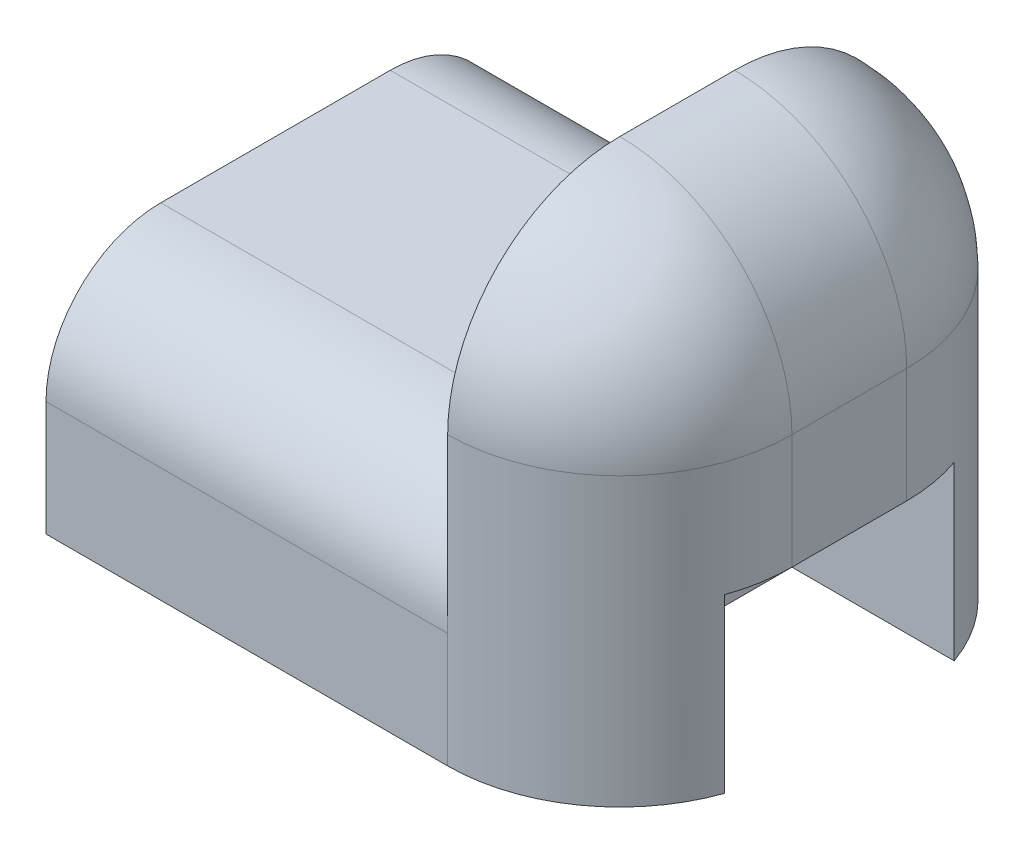
ISO-10303-21;
HEADER;
FILE_DESCRIPTION(('STEP AP214'),'2;1');
FILE_NAME('part.step','',(''),(''),'','','');
FILE_SCHEMA(('AUTOMOTIVE_DESIGN { 1 0 10303 214 1 1 1 1 }'));
ENDSEC;
DATA;
#1=APPLICATION_CONTEXT('core data for automotive mechanical design processes');
#2=APPLICATION_PROTOCOL_DEFINITION('international standard','automotive_design',2000,#1);
#3=PRODUCT_CONTEXT('',#1,'mechanical');
#4=PRODUCT('Part','Part','',(#3));
#5=PRODUCT_RELATED_PRODUCT_CATEGORY('part','',(#4));
#6=PRODUCT_DEFINITION_FORMATION('','',#4);
#7=PRODUCT_DEFINITION_CONTEXT('part definition',#1,'design');
#8=PRODUCT_DEFINITION('design','',#6,#7);
#9=PRODUCT_DEFINITION_SHAPE('','',#8);
#10=(LENGTH_UNIT() NAMED_UNIT(*) SI_UNIT(.MILLI.,.METRE.));
#11=(NAMED_UNIT(*) PLANE_ANGLE_UNIT() SI_UNIT($,.RADIAN.));
#12=(NAMED_UNIT(*) SI_UNIT($,.STERADIAN.) SOLID_ANGLE_UNIT());
#13=UNCERTAINTY_MEASURE_WITH_UNIT(LENGTH_MEASURE(1.E-05),#10,'distance_accuracy_value','');
#14=(GEOMETRIC_REPRESENTATION_CONTEXT(3) GLOBAL_UNCERTAINTY_ASSIGNED_CONTEXT((#13)) GLOBAL_UNIT_ASSIGNED_CONTEXT((#10,
#11,#12)) REPRESENTATION_CONTEXT('',''));
#15=CARTESIAN_POINT('',(0.,0.,0.));
#16=DIRECTION('',(0.,0.,1.));
#17=DIRECTION('',(1.,0.,0.));
#18=AXIS2_PLACEMENT_3D('',#15,#16,#17);
#19=CARTESIAN_POINT('',(-50.,80.,-20.));
#20=DIRECTION('',(1.,0.,0.));
#21=DIRECTION('',(0.,0.,-1.));
#22=AXIS2_PLACEMENT_3D('',#19,#20,#21);
#23=PLANE('',#22);
#24=DIRECTION('',(0.,0.,1.));
#25=VECTOR('',#24,1.);
#26=CARTESIAN_POINT('',(-50.,40.,-20.));
#27=LINE('',#26,#25);
#28=CARTESIAN_POINT('',(-50.,40.,0.));
#29=VERTEX_POINT('',#28);
#30=CARTESIAN_POINT('',(-50.,40.,40.));
#31=VERTEX_POINT('',#30);
#32=EDGE_CURVE('E326',#29,#31,#27,.T.);
#33=ORIENTED_EDGE('',*,*,#32,.F.);
#34=CARTESIAN_POINT('',(-50.,20.,0.));
#35=DIRECTION('',(1.,0.,0.));
#36=DIRECTION('',(0.,0.,-1.));
#37=AXIS2_PLACEMENT_3D('',#34,#35,#36);
#38=CIRCLE('',#37,20.);
#39=CARTESIAN_POINT('',(-50.,20.,-20.));
#40=VERTEX_POINT('',#39);
#41=EDGE_CURVE('E61',#29,#40,#38,.F.);
#42=ORIENTED_EDGE('',*,*,#41,.T.);
#43=DIRECTION('',(0.,-1.,0.));
#44=VECTOR('',#43,1.);
#45=CARTESIAN_POINT('',(-50.,80.,-20.));
#46=LINE('',#45,#44);
#47=CARTESIAN_POINT('',(-50.,0.,-20.));
#48=VERTEX_POINT('',#47);
#49=EDGE_CURVE('E247',#40,#48,#46,.T.);
#50=ORIENTED_EDGE('',*,*,#49,.T.);
#51=DIRECTION('',(0.,0.,1.));
#52=VECTOR('',#51,1.);
#53=CARTESIAN_POINT('',(-50.,0.,-20.));
#54=LINE('',#53,#52);
#55=CARTESIAN_POINT('',(-50.,0.,0.));
#56=VERTEX_POINT('',#55);
#57=EDGE_CURVE('E244',#48,#56,#54,.T.);
#58=ORIENTED_EDGE('',*,*,#57,.T.);
#59=DIRECTION('',(0.,-1.,0.));
#60=VECTOR('',#59,1.);
#61=CARTESIAN_POINT('',(-50.,0.,0.));
#62=LINE('',#61,#60);
#63=CARTESIAN_POINT('',(-50.,30.,0.));
#64=VERTEX_POINT('',#63);
#65=EDGE_CURVE('E233',#64,#56,#62,.T.);
#66=ORIENTED_EDGE('',*,*,#65,.F.);
#67=DIRECTION('',(0.,0.,1.));
#68=VECTOR('',#67,1.);
#69=CARTESIAN_POINT('',(-50.,30.,0.));
#70=LINE('',#69,#68);
#71=CARTESIAN_POINT('',(-50.,30.,40.));
#72=VERTEX_POINT('',#71);
#73=EDGE_CURVE('E236',#64,#72,#70,.T.);
#74=ORIENTED_EDGE('',*,*,#73,.T.);
#75=DIRECTION('',(0.,-1.,0.));
#76=VECTOR('',#75,1.);
#77=CARTESIAN_POINT('',(-50.,0.,40.));
#78=LINE('',#77,#76);
#79=CARTESIAN_POINT('',(-50.,0.,40.));
#80=VERTEX_POINT('',#79);
#81=EDGE_CURVE('E197',#72,#80,#78,.T.);
#82=ORIENTED_EDGE('',*,*,#81,.T.);
#83=DIRECTION('',(0.,0.,-1.));
#84=VECTOR('',#83,1.);
#85=CARTESIAN_POINT('',(-50.,0.,60.));
#86=LINE('',#85,#84);
#87=CARTESIAN_POINT('',(-50.,0.,60.));
#88=VERTEX_POINT('',#87);
#89=EDGE_CURVE('E206',#88,#80,#86,.T.);
#90=ORIENTED_EDGE('',*,*,#89,.F.);
#91=DIRECTION('',(0.,-1.,0.));
#92=VECTOR('',#91,1.);
#93=CARTESIAN_POINT('',(-50.,80.,60.));
#94=LINE('',#93,#92);
#95=CARTESIAN_POINT('',(-50.,20.,60.));
#96=VERTEX_POINT('',#95);
#97=EDGE_CURVE('E212',#96,#88,#94,.T.);
#98=ORIENTED_EDGE('',*,*,#97,.F.);
#99=CARTESIAN_POINT('',(-50.,20.,40.));
#100=DIRECTION('',(1.,0.,0.));
#101=DIRECTION('',(0.,0.,-1.));
#102=AXIS2_PLACEMENT_3D('',#99,#100,#101);
#103=CIRCLE('',#102,20.);
#104=EDGE_CURVE('E297',#96,#31,#103,.F.);
#105=ORIENTED_EDGE('',*,*,#104,.T.);
#106=EDGE_LOOP('',(#33,#42,#50,#58,#66,#74,#82,#90,#98,#105));
#107=FACE_BOUND('',#106,.T.);
#108=ADVANCED_FACE('F39',(#107),#23,.F.);
#109=CARTESIAN_POINT('',(50.,80.,-20.));
#110=DIRECTION('',(-1.,0.,0.));
#111=DIRECTION('',(0.,0.,1.));
#112=AXIS2_PLACEMENT_3D('',#109,#110,#111);
#113=PLANE('',#112);
#114=DIRECTION('',(0.,0.,1.));
#115=VECTOR('',#114,1.);
#116=CARTESIAN_POINT('',(50.,30.,0.));
#117=LINE('',#116,#115);
#118=CARTESIAN_POINT('',(50.,30.,9.99999999999999));
#119=VERTEX_POINT('',#118);
#120=CARTESIAN_POINT('',(50.,30.,30.));
#121=VERTEX_POINT('',#120);
#122=EDGE_CURVE('E183',#119,#121,#117,.T.);
#123=ORIENTED_EDGE('',*,*,#122,.F.);
#124=DIRECTION('',(0.,-1.,0.));
#125=VECTOR('',#124,1.);
#126=CARTESIAN_POINT('',(50.,80.,9.99999999999999));
#127=LINE('',#126,#125);
#128=CARTESIAN_POINT('',(50.,50.,9.99999999999999));
#129=VERTEX_POINT('',#128);
#130=EDGE_CURVE('E283',#119,#129,#127,.F.);
#131=ORIENTED_EDGE('',*,*,#130,.T.);
#132=DIRECTION('',(0.,0.,-1.));
#133=VECTOR('',#132,1.);
#134=CARTESIAN_POINT('',(50.,50.,60.));
#135=LINE('',#134,#133);
#136=CARTESIAN_POINT('',(50.,50.,30.));
#137=VERTEX_POINT('',#136);
#138=EDGE_CURVE('E252',#129,#137,#135,.F.);
#139=ORIENTED_EDGE('',*,*,#138,.T.);
#140=DIRECTION('',(0.,-1.,0.));
#141=VECTOR('',#140,1.);
#142=CARTESIAN_POINT('',(50.,0.,30.));
#143=LINE('',#142,#141);
#144=EDGE_CURVE('E254',#137,#121,#143,.T.);
#145=ORIENTED_EDGE('',*,*,#144,.T.);
#146=EDGE_LOOP('',(#123,#131,#139,#145));
#147=FACE_BOUND('',#146,.T.);
#148=ADVANCED_FACE('F345',(#147),#113,.F.);
#149=CARTESIAN_POINT('',(0.,0.,0.));
#150=DIRECTION('',(0.,1.,0.));
#151=DIRECTION('',(0.,0.,1.));
#152=AXIS2_PLACEMENT_3D('',#149,#150,#151);
#153=PLANE('',#152);
#154=DIRECTION('',(-1.,0.,0.));
#155=VECTOR('',#154,1.);
#156=CARTESIAN_POINT('',(-50.,0.,-20.));
#157=LINE('',#156,#155);
#158=CARTESIAN_POINT('',(20.,0.,-20.));
#159=VERTEX_POINT('',#158);
#160=EDGE_CURVE('E238',#159,#48,#157,.T.);
#161=ORIENTED_EDGE('',*,*,#160,.F.);
#162=CARTESIAN_POINT('',(20.,0.,10.));
#163=DIRECTION('',(0.,1.,0.));
#164=DIRECTION('',(0.,0.,1.));
#165=AXIS2_PLACEMENT_3D('',#162,#163,#164);
#166=CIRCLE('',#165,30.);
#167=CARTESIAN_POINT('',(48.2842712474619,0.,0.));
#168=VERTEX_POINT('',#167);
#169=EDGE_CURVE('E277',#159,#168,#166,.F.);
#170=ORIENTED_EDGE('',*,*,#169,.T.);
#171=DIRECTION('',(1.,0.,0.));
#172=VECTOR('',#171,1.);
#173=CARTESIAN_POINT('',(0.,0.,0.));
#174=LINE('',#173,#172);
#175=CARTESIAN_POINT('',(20.,0.,0.));
#176=VERTEX_POINT('',#175);
#177=EDGE_CURVE('E218',#176,#168,#174,.T.);
#178=ORIENTED_EDGE('',*,*,#177,.F.);
#179=DIRECTION('',(0.,0.,1.));
#180=VECTOR('',#179,1.);
#181=CARTESIAN_POINT('',(20.,0.,0.));
#182=LINE('',#181,#180);
#183=CARTESIAN_POINT('',(20.,0.,40.));
#184=VERTEX_POINT('',#183);
#185=EDGE_CURVE('E222',#176,#184,#182,.T.);
#186=ORIENTED_EDGE('',*,*,#185,.T.);
#187=DIRECTION('',(1.,0.,0.));
#188=VECTOR('',#187,1.);
#189=CARTESIAN_POINT('',(0.,0.,40.));
#190=LINE('',#189,#188);
#191=CARTESIAN_POINT('',(48.2842712474619,0.,40.));
#192=VERTEX_POINT('',#191);
#193=EDGE_CURVE('E173',#184,#192,#190,.T.);
#194=ORIENTED_EDGE('',*,*,#193,.T.);
#195=CARTESIAN_POINT('',(20.,0.,30.));
#196=DIRECTION('',(0.,1.,0.));
#197=DIRECTION('',(0.,0.,1.));
#198=AXIS2_PLACEMENT_3D('',#195,#196,#197);
#199=CIRCLE('',#198,30.);
#200=CARTESIAN_POINT('',(20.,0.,60.));
#201=VERTEX_POINT('',#200);
#202=EDGE_CURVE('E260',#192,#201,#199,.F.);
#203=ORIENTED_EDGE('',*,*,#202,.T.);
#204=DIRECTION('',(-1.,0.,0.));
#205=VECTOR('',#204,1.);
#206=CARTESIAN_POINT('',(-50.,0.,60.));
#207=LINE('',#206,#205);
#208=EDGE_CURVE('E209',#201,#88,#207,.T.);
#209=ORIENTED_EDGE('',*,*,#208,.T.);
#210=ORIENTED_EDGE('',*,*,#89,.T.);
#211=DIRECTION('',(1.,0.,0.));
#212=VECTOR('',#211,1.);
#213=CARTESIAN_POINT('',(0.,0.,40.));
#214=LINE('',#213,#212);
#215=CARTESIAN_POINT('',(-20.,0.,40.));
#216=VERTEX_POINT('',#215);
#217=EDGE_CURVE('E194',#80,#216,#214,.T.);
#218=ORIENTED_EDGE('',*,*,#217,.T.);
#219=DIRECTION('',(0.,0.,1.));
#220=VECTOR('',#219,1.);
#221=CARTESIAN_POINT('',(-20.,0.,0.));
#222=LINE('',#221,#220);
#223=CARTESIAN_POINT('',(-20.,0.,0.));
#224=VERTEX_POINT('',#223);
#225=EDGE_CURVE('E235',#224,#216,#222,.T.);
#226=ORIENTED_EDGE('',*,*,#225,.F.);
#227=DIRECTION('',(1.,0.,0.));
#228=VECTOR('',#227,1.);
#229=CARTESIAN_POINT('',(0.,0.,0.));
#230=LINE('',#229,#228);
#231=EDGE_CURVE('E182',#56,#224,#230,.T.);
#232=ORIENTED_EDGE('',*,*,#231,.F.);
#233=ORIENTED_EDGE('',*,*,#57,.F.);
#234=EDGE_LOOP('',(#161,#170,#178,#186,#194,#203,#209,#210,#218,#226,#232,#233));
#235=FACE_BOUND('',#234,.T.);
#236=ADVANCED_FACE('F356',(#235),#153,.F.);
#237=CARTESIAN_POINT('',(-50.,80.,-20.));
#238=DIRECTION('',(0.,0.,1.));
#239=DIRECTION('',(1.,0.,0.));
#240=AXIS2_PLACEMENT_3D('',#237,#238,#239);
#241=PLANE('',#240);
#242=ORIENTED_EDGE('',*,*,#49,.F.);
#243=DIRECTION('',(-1.,0.,0.));
#244=VECTOR('',#243,1.);
#245=CARTESIAN_POINT('',(20.,20.,-20.));
#246=LINE('',#245,#244);
#247=CARTESIAN_POINT('',(20.,20.,-20.));
#248=VERTEX_POINT('',#247);
#249=EDGE_CURVE('E47',#40,#248,#246,.F.);
#250=ORIENTED_EDGE('',*,*,#249,.T.);
#251=DIRECTION('',(0.,-1.,0.));
#252=VECTOR('',#251,1.);
#253=CARTESIAN_POINT('',(20.,80.,-20.));
#254=LINE('',#253,#252);
#255=EDGE_CURVE('E270',#248,#159,#254,.T.);
#256=ORIENTED_EDGE('',*,*,#255,.T.);
#257=ORIENTED_EDGE('',*,*,#160,.T.);
#258=EDGE_LOOP('',(#242,#250,#256,#257));
#259=FACE_BOUND('',#258,.T.);
#260=ADVANCED_FACE('F309',(#259),#241,.F.);
#261=CARTESIAN_POINT('',(0.,30.,0.));
#262=DIRECTION('',(0.,-1.,0.));
#263=DIRECTION('',(1.,0.,0.));
#264=AXIS2_PLACEMENT_3D('',#261,#262,#263);
#265=PLANE('',#264);
#266=DIRECTION('',(0.,0.,1.));
#267=VECTOR('',#266,1.);
#268=CARTESIAN_POINT('',(-20.,30.,0.));
#269=LINE('',#268,#267);
#270=CARTESIAN_POINT('',(-20.,30.,0.));
#271=VERTEX_POINT('',#270);
#272=CARTESIAN_POINT('',(-20.,30.,40.));
#273=VERTEX_POINT('',#272);
#274=EDGE_CURVE('E239',#271,#273,#269,.T.);
#275=ORIENTED_EDGE('',*,*,#274,.T.);
#276=DIRECTION('',(1.,0.,0.));
#277=VECTOR('',#276,1.);
#278=CARTESIAN_POINT('',(0.,30.,40.));
#279=LINE('',#278,#277);
#280=EDGE_CURVE('E200',#72,#273,#279,.T.);
#281=ORIENTED_EDGE('',*,*,#280,.F.);
#282=ORIENTED_EDGE('',*,*,#73,.F.);
#283=DIRECTION('',(1.,0.,0.));
#284=VECTOR('',#283,1.);
#285=CARTESIAN_POINT('',(0.,30.,0.));
#286=LINE('',#285,#284);
#287=EDGE_CURVE('E231',#64,#271,#286,.T.);
#288=ORIENTED_EDGE('',*,*,#287,.T.);
#289=EDGE_LOOP('',(#275,#281,#282,#288));
#290=FACE_BOUND('',#289,.T.);
#291=ADVANCED_FACE('F383',(#290),#265,.T.);
#292=CARTESIAN_POINT('',(-20.,0.,0.));
#293=DIRECTION('',(1.,0.,0.));
#294=DIRECTION('',(0.,1.,0.));
#295=AXIS2_PLACEMENT_3D('',#292,#293,#294);
#296=PLANE('',#295);
#297=ORIENTED_EDGE('',*,*,#225,.T.);
#298=DIRECTION('',(0.,1.,0.));
#299=VECTOR('',#298,1.);
#300=CARTESIAN_POINT('',(-20.,0.,40.));
#301=LINE('',#300,#299);
#302=EDGE_CURVE('E203',#216,#273,#301,.T.);
#303=ORIENTED_EDGE('',*,*,#302,.T.);
#304=ORIENTED_EDGE('',*,*,#274,.F.);
#305=DIRECTION('',(0.,1.,0.));
#306=VECTOR('',#305,1.);
#307=CARTESIAN_POINT('',(-20.,0.,0.));
#308=LINE('',#307,#306);
#309=EDGE_CURVE('E228',#224,#271,#308,.T.);
#310=ORIENTED_EDGE('',*,*,#309,.F.);
#311=EDGE_LOOP('',(#297,#303,#304,#310));
#312=FACE_BOUND('',#311,.T.);
#313=ADVANCED_FACE('F420',(#312),#296,.F.);
#314=CARTESIAN_POINT('',(0.,0.,0.));
#315=DIRECTION('',(0.,0.,1.));
#316=DIRECTION('',(1.,0.,0.));
#317=AXIS2_PLACEMENT_3D('',#314,#315,#316);
#318=PLANE('',#317);
#319=CARTESIAN_POINT('',(-43.,7.,0.));
#320=DIRECTION('',(0.,0.,1.));
#321=DIRECTION('',(1.,0.,0.));
#322=AXIS2_PLACEMENT_3D('',#319,#320,#321);
#323=CIRCLE('',#322,5.);
#324=CARTESIAN_POINT('',(-38.,7.,0.));
#325=VERTEX_POINT('',#324);
#326=EDGE_CURVE('E214',#325,#325,#323,.T.);
#327=ORIENTED_EDGE('',*,*,#326,.F.);
#328=EDGE_LOOP('',(#327));
#329=FACE_BOUND('',#328,.T.);
#330=ORIENTED_EDGE('',*,*,#231,.T.);
#331=ORIENTED_EDGE('',*,*,#309,.T.);
#332=ORIENTED_EDGE('',*,*,#287,.F.);
#333=ORIENTED_EDGE('',*,*,#65,.T.);
#334=EDGE_LOOP('',(#330,#331,#332,#333));
#335=FACE_BOUND('',#334,.T.);
#336=ADVANCED_FACE('F418',(#329,#335),#318,.T.);
#337=CARTESIAN_POINT('',(20.,0.,0.));
#338=DIRECTION('',(1.,0.,0.));
#339=DIRECTION('',(0.,0.,-1.));
#340=AXIS2_PLACEMENT_3D('',#337,#338,#339);
#341=PLANE('',#340);
#342=DIRECTION('',(0.,0.,1.));
#343=VECTOR('',#342,1.);
#344=CARTESIAN_POINT('',(20.,30.,0.));
#345=LINE('',#344,#343);
#346=CARTESIAN_POINT('',(20.,30.,0.));
#347=VERTEX_POINT('',#346);
#348=CARTESIAN_POINT('',(20.,30.,40.));
#349=VERTEX_POINT('',#348);
#350=EDGE_CURVE('E167',#347,#349,#345,.T.);
#351=ORIENTED_EDGE('',*,*,#350,.T.);
#352=DIRECTION('',(0.,1.,0.));
#353=VECTOR('',#352,1.);
#354=CARTESIAN_POINT('',(20.,0.,40.));
#355=LINE('',#354,#353);
#356=EDGE_CURVE('E174',#184,#349,#355,.T.);
#357=ORIENTED_EDGE('',*,*,#356,.F.);
#358=ORIENTED_EDGE('',*,*,#185,.F.);
#359=DIRECTION('',(0.,1.,0.));
#360=VECTOR('',#359,1.);
#361=CARTESIAN_POINT('',(20.,0.,0.));
#362=LINE('',#361,#360);
#363=EDGE_CURVE('E181',#176,#347,#362,.T.);
#364=ORIENTED_EDGE('',*,*,#363,.T.);
#365=EDGE_LOOP('',(#351,#357,#358,#364));
#366=FACE_BOUND('',#365,.T.);
#367=ADVANCED_FACE('F179',(#366),#341,.T.);
#368=CARTESIAN_POINT('',(0.,30.,0.));
#369=DIRECTION('',(0.,1.,0.));
#370=DIRECTION('',(-1.,0.,0.));
#371=AXIS2_PLACEMENT_3D('',#368,#369,#370);
#372=PLANE('',#371);
#373=CARTESIAN_POINT('',(43.,30.,20.));
#374=DIRECTION('',(0.,-1.,0.));
#375=DIRECTION('',(1.,0.,0.));
#376=AXIS2_PLACEMENT_3D('',#373,#374,#375);
#377=CIRCLE('',#376,5.);
#378=CARTESIAN_POINT('',(48.,30.,20.));
#379=VERTEX_POINT('',#378);
#380=EDGE_CURVE('E623',#379,#379,#377,.T.);
#381=ORIENTED_EDGE('',*,*,#380,.F.);
#382=EDGE_LOOP('',(#381));
#383=FACE_BOUND('',#382,.T.);
#384=DIRECTION('',(-1.,0.,0.));
#385=VECTOR('',#384,1.);
#386=CARTESIAN_POINT('',(0.,30.,0.));
#387=LINE('',#386,#385);
#388=CARTESIAN_POINT('',(48.2842712474619,30.,0.));
#389=VERTEX_POINT('',#388);
#390=EDGE_CURVE('E221',#389,#347,#387,.T.);
#391=ORIENTED_EDGE('',*,*,#390,.F.);
#392=CARTESIAN_POINT('',(20.,30.,10.));
#393=DIRECTION('',(0.,1.,0.));
#394=DIRECTION('',(-1.,0.,0.));
#395=AXIS2_PLACEMENT_3D('',#392,#393,#394);
#396=CIRCLE('',#395,30.);
#397=EDGE_CURVE('E281',#389,#119,#396,.F.);
#398=ORIENTED_EDGE('',*,*,#397,.T.);
#399=ORIENTED_EDGE('',*,*,#122,.T.);
#400=CARTESIAN_POINT('',(20.,30.,30.));
#401=DIRECTION('',(0.,1.,0.));
#402=DIRECTION('',(-1.,0.,0.));
#403=AXIS2_PLACEMENT_3D('',#400,#401,#402);
#404=CIRCLE('',#403,30.);
#405=CARTESIAN_POINT('',(48.2842712474619,30.,40.));
#406=VERTEX_POINT('',#405);
#407=EDGE_CURVE('E169',#121,#406,#404,.F.);
#408=ORIENTED_EDGE('',*,*,#407,.T.);
#409=DIRECTION('',(-1.,0.,0.));
#410=VECTOR('',#409,1.);
#411=CARTESIAN_POINT('',(0.,30.,40.));
#412=LINE('',#411,#410);
#413=EDGE_CURVE('E163',#406,#349,#412,.T.);
#414=ORIENTED_EDGE('',*,*,#413,.T.);
#415=ORIENTED_EDGE('',*,*,#350,.F.);
#416=EDGE_LOOP('',(#391,#398,#399,#408,#414,#415));
#417=FACE_BOUND('',#416,.T.);
#418=ADVANCED_FACE('F166',(#383,#417),#372,.F.);
#419=CARTESIAN_POINT('',(0.,0.,0.));
#420=DIRECTION('',(0.,0.,1.));
#421=DIRECTION('',(1.,0.,0.));
#422=AXIS2_PLACEMENT_3D('',#419,#420,#421);
#423=PLANE('',#422);
#424=ORIENTED_EDGE('',*,*,#177,.T.);
#425=DIRECTION('',(0.,-1.,0.));
#426=VECTOR('',#425,1.);
#427=CARTESIAN_POINT('',(48.2842712474619,0.,0.));
#428=LINE('',#427,#426);
#429=EDGE_CURVE('E279',#168,#389,#428,.F.);
#430=ORIENTED_EDGE('',*,*,#429,.T.);
#431=ORIENTED_EDGE('',*,*,#390,.T.);
#432=ORIENTED_EDGE('',*,*,#363,.F.);
#433=EDGE_LOOP('',(#424,#430,#431,#432));
#434=FACE_BOUND('',#433,.T.);
#435=ADVANCED_FACE('F360',(#434),#423,.T.);
#436=CARTESIAN_POINT('',(-43.,7.,20.));
#437=DIRECTION('',(0.,0.,-1.));
#438=DIRECTION('',(-1.,0.,0.));
#439=AXIS2_PLACEMENT_3D('',#436,#437,#438);
#440=CYLINDRICAL_SURFACE('',#439,5.);
#441=ORIENTED_EDGE('',*,*,#326,.T.);
#442=EDGE_LOOP('',(#441));
#443=FACE_BOUND('',#442,.T.);
#444=CARTESIAN_POINT('',(-43.,7.,40.));
#445=DIRECTION('',(0.,0.,-1.));
#446=DIRECTION('',(-1.,0.,0.));
#447=AXIS2_PLACEMENT_3D('',#444,#445,#446);
#448=CIRCLE('',#447,5.);
#449=CARTESIAN_POINT('',(-48.,7.,40.));
#450=VERTEX_POINT('',#449);
#451=EDGE_CURVE('E249',#450,#450,#448,.T.);
#452=ORIENTED_EDGE('',*,*,#451,.T.);
#453=EDGE_LOOP('',(#452));
#454=FACE_BOUND('',#453,.T.);
#455=ADVANCED_FACE('F362',(#443,#454),#440,.T.);
#456=CARTESIAN_POINT('',(-50.,80.,60.));
#457=DIRECTION('',(0.,0.,1.));
#458=DIRECTION('',(1.,0.,0.));
#459=AXIS2_PLACEMENT_3D('',#456,#457,#458);
#460=PLANE('',#459);
#461=DIRECTION('',(0.,-1.,0.));
#462=VECTOR('',#461,1.);
#463=CARTESIAN_POINT('',(20.,50.,60.));
#464=LINE('',#463,#462);
#465=CARTESIAN_POINT('',(20.,20.,60.));
#466=VERTEX_POINT('',#465);
#467=EDGE_CURVE('E262',#201,#466,#464,.F.);
#468=ORIENTED_EDGE('',*,*,#467,.T.);
#469=DIRECTION('',(1.,0.,0.));
#470=VECTOR('',#469,1.);
#471=CARTESIAN_POINT('',(-50.,20.,60.));
#472=LINE('',#471,#470);
#473=EDGE_CURVE('E295',#466,#96,#472,.F.);
#474=ORIENTED_EDGE('',*,*,#473,.T.);
#475=ORIENTED_EDGE('',*,*,#97,.T.);
#476=ORIENTED_EDGE('',*,*,#208,.F.);
#477=EDGE_LOOP('',(#468,#474,#475,#476));
#478=FACE_BOUND('',#477,.T.);
#479=ADVANCED_FACE('F368',(#478),#460,.T.);
#480=CARTESIAN_POINT('',(0.,0.,40.));
#481=DIRECTION('',(0.,0.,-1.));
#482=DIRECTION('',(1.,0.,0.));
#483=AXIS2_PLACEMENT_3D('',#480,#481,#482);
#484=PLANE('',#483);
#485=ORIENTED_EDGE('',*,*,#451,.F.);
#486=EDGE_LOOP('',(#485));
#487=FACE_BOUND('',#486,.T.);
#488=ORIENTED_EDGE('',*,*,#217,.F.);
#489=ORIENTED_EDGE('',*,*,#81,.F.);
#490=ORIENTED_EDGE('',*,*,#280,.T.);
#491=ORIENTED_EDGE('',*,*,#302,.F.);
#492=EDGE_LOOP('',(#488,#489,#490,#491));
#493=FACE_BOUND('',#492,.T.);
#494=ADVANCED_FACE('F411',(#487,#493),#484,.T.);
#495=CARTESIAN_POINT('',(0.,0.,40.));
#496=DIRECTION('',(0.,0.,-1.));
#497=DIRECTION('',(1.,0.,0.));
#498=AXIS2_PLACEMENT_3D('',#495,#496,#497);
#499=PLANE('',#498);
#500=ORIENTED_EDGE('',*,*,#413,.F.);
#501=DIRECTION('',(0.,1.,0.));
#502=VECTOR('',#501,1.);
#503=CARTESIAN_POINT('',(48.2842712474619,30.,40.));
#504=LINE('',#503,#502);
#505=EDGE_CURVE('E258',#406,#192,#504,.F.);
#506=ORIENTED_EDGE('',*,*,#505,.T.);
#507=ORIENTED_EDGE('',*,*,#193,.F.);
#508=ORIENTED_EDGE('',*,*,#356,.T.);
#509=EDGE_LOOP('',(#500,#506,#507,#508));
#510=FACE_BOUND('',#509,.T.);
#511=ADVANCED_FACE('F186',(#510),#499,.T.);
#512=CARTESIAN_POINT('',(20.,40.,-20.));
#513=DIRECTION('',(1.,0.,0.));
#514=DIRECTION('',(0.,0.,-1.));
#515=AXIS2_PLACEMENT_3D('',#512,#513,#514);
#516=PLANE('',#515);
#517=DIRECTION('',(0.,0.,-1.));
#518=VECTOR('',#517,1.);
#519=CARTESIAN_POINT('',(20.,80.,-20.));
#520=LINE('',#519,#518);
#521=CARTESIAN_POINT('',(20.,80.,30.));
#522=VERTEX_POINT('',#521);
#523=CARTESIAN_POINT('',(20.,80.,10.));
#524=VERTEX_POINT('',#523);
#525=EDGE_CURVE('E274',#522,#524,#520,.T.);
#526=ORIENTED_EDGE('',*,*,#525,.T.);
#527=CARTESIAN_POINT('',(20.,50.,10.));
#528=DIRECTION('',(1.,0.,0.));
#529=DIRECTION('',(0.,0.,-1.));
#530=AXIS2_PLACEMENT_3D('',#527,#528,#529);
#531=CIRCLE('',#530,30.);
#532=CARTESIAN_POINT('',(20.,50.,-20.));
#533=VERTEX_POINT('',#532);
#534=EDGE_CURVE('E287',#524,#533,#531,.F.);
#535=ORIENTED_EDGE('',*,*,#534,.T.);
#536=DIRECTION('',(0.,1.,0.));
#537=VECTOR('',#536,1.);
#538=CARTESIAN_POINT('',(20.,40.,-20.));
#539=LINE('',#538,#537);
#540=EDGE_CURVE('E53',#248,#533,#539,.T.);
#541=ORIENTED_EDGE('',*,*,#540,.F.);
#542=CARTESIAN_POINT('',(20.,20.,0.));
#543=DIRECTION('',(1.,0.,0.));
#544=DIRECTION('',(0.,0.,-1.));
#545=AXIS2_PLACEMENT_3D('',#542,#543,#544);
#546=CIRCLE('',#545,20.);
#547=CARTESIAN_POINT('',(20.,40.,0.));
#548=VERTEX_POINT('',#547);
#549=EDGE_CURVE('E11',#248,#548,#546,.T.);
#550=ORIENTED_EDGE('',*,*,#549,.T.);
#551=DIRECTION('',(0.,0.,-1.));
#552=VECTOR('',#551,1.);
#553=CARTESIAN_POINT('',(20.,40.,-20.));
#554=LINE('',#553,#552);
#555=CARTESIAN_POINT('',(20.,40.,40.));
#556=VERTEX_POINT('',#555);
#557=EDGE_CURVE('E322',#556,#548,#554,.T.);
#558=ORIENTED_EDGE('',*,*,#557,.F.);
#559=CARTESIAN_POINT('',(20.,20.,40.));
#560=DIRECTION('',(1.,0.,0.));
#561=DIRECTION('',(0.,0.,-1.));
#562=AXIS2_PLACEMENT_3D('',#559,#560,#561);
#563=CIRCLE('',#562,20.);
#564=EDGE_CURVE('E300',#556,#466,#563,.T.);
#565=ORIENTED_EDGE('',*,*,#564,.T.);
#566=DIRECTION('',(0.,1.,0.));
#567=VECTOR('',#566,1.);
#568=CARTESIAN_POINT('',(20.,40.,60.));
#569=LINE('',#568,#567);
#570=CARTESIAN_POINT('',(20.,50.,60.));
#571=VERTEX_POINT('',#570);
#572=EDGE_CURVE('E189',#466,#571,#569,.T.);
#573=ORIENTED_EDGE('',*,*,#572,.T.);
#574=CARTESIAN_POINT('',(20.,50.,30.));
#575=DIRECTION('',(1.,0.,0.));
#576=DIRECTION('',(0.,0.,-1.));
#577=AXIS2_PLACEMENT_3D('',#574,#575,#576);
#578=CIRCLE('',#577,30.);
#579=EDGE_CURVE('E265',#571,#522,#578,.F.);
#580=ORIENTED_EDGE('',*,*,#579,.T.);
#581=EDGE_LOOP('',(#526,#535,#541,#550,#558,#565,#573,#580));
#582=FACE_BOUND('',#581,.T.);
#583=ADVANCED_FACE('F321',(#582),#516,.F.);
#584=CARTESIAN_POINT('',(0.,40.,0.));
#585=DIRECTION('',(0.,1.,0.));
#586=DIRECTION('',(0.,0.,1.));
#587=AXIS2_PLACEMENT_3D('',#584,#585,#586);
#588=PLANE('',#587);
#589=ORIENTED_EDGE('',*,*,#557,.T.);
#590=DIRECTION('',(-1.,0.,0.));
#591=VECTOR('',#590,1.);
#592=CARTESIAN_POINT('',(-50.,40.,0.));
#593=LINE('',#592,#591);
#594=EDGE_CURVE('E303',#548,#29,#593,.T.);
#595=ORIENTED_EDGE('',*,*,#594,.T.);
#596=ORIENTED_EDGE('',*,*,#32,.T.);
#597=DIRECTION('',(1.,0.,0.));
#598=VECTOR('',#597,1.);
#599=CARTESIAN_POINT('',(0.,40.,40.));
#600=LINE('',#599,#598);
#601=EDGE_CURVE('E289',#31,#556,#600,.T.);
#602=ORIENTED_EDGE('',*,*,#601,.T.);
#603=EDGE_LOOP('',(#589,#595,#596,#602));
#604=FACE_BOUND('',#603,.T.);
#605=ADVANCED_FACE('F324',(#604),#588,.T.);
#606=CARTESIAN_POINT('',(20.,50.,0.));
#607=DIRECTION('',(0.,0.,1.));
#608=DIRECTION('',(1.,0.,0.));
#609=AXIS2_PLACEMENT_3D('',#606,#607,#608);
#610=CYLINDRICAL_SURFACE('',#609,30.);
#611=ORIENTED_EDGE('',*,*,#138,.F.);
#612=CARTESIAN_POINT('',(20.,50.,10.));
#613=DIRECTION('',(0.,0.,1.));
#614=DIRECTION('',(1.,0.,0.));
#615=AXIS2_PLACEMENT_3D('',#612,#613,#614);
#616=CIRCLE('',#615,30.);
#617=EDGE_CURVE('E285',#129,#524,#616,.T.);
#618=ORIENTED_EDGE('',*,*,#617,.T.);
#619=ORIENTED_EDGE('',*,*,#525,.F.);
#620=CARTESIAN_POINT('',(20.,50.,30.));
#621=DIRECTION('',(0.,0.,1.));
#622=DIRECTION('',(1.,0.,0.));
#623=AXIS2_PLACEMENT_3D('',#620,#621,#622);
#624=CIRCLE('',#623,30.);
#625=EDGE_CURVE('E267',#522,#137,#624,.F.);
#626=ORIENTED_EDGE('',*,*,#625,.T.);
#627=EDGE_LOOP('',(#611,#618,#619,#626));
#628=FACE_BOUND('',#627,.T.);
#629=ADVANCED_FACE('F346',(#628),#610,.T.);
#630=CARTESIAN_POINT('',(20.,50.,30.));
#631=DIRECTION('',(0.,0.,1.));
#632=DIRECTION('',(1.,0.,0.));
#633=AXIS2_PLACEMENT_3D('',#630,#631,#632);
#634=SPHERICAL_SURFACE('',#633,30.);
#635=ORIENTED_EDGE('',*,*,#625,.F.);
#636=ORIENTED_EDGE('',*,*,#579,.F.);
#637=CARTESIAN_POINT('',(20.,50.,30.));
#638=DIRECTION('',(0.,-1.,0.));
#639=DIRECTION('',(0.,0.,-1.));
#640=AXIS2_PLACEMENT_3D('',#637,#638,#639);
#641=CIRCLE('',#640,30.);
#642=EDGE_CURVE('E271',#137,#571,#641,.T.);
#643=ORIENTED_EDGE('',*,*,#642,.F.);
#644=EDGE_LOOP('',(#635,#636,#643));
#645=FACE_BOUND('',#644,.T.);
#646=ADVANCED_FACE('F350',(#645),#634,.T.);
#647=CARTESIAN_POINT('',(20.,80.,30.));
#648=DIRECTION('',(0.,1.,0.));
#649=DIRECTION('',(0.,0.,1.));
#650=AXIS2_PLACEMENT_3D('',#647,#648,#649);
#651=CYLINDRICAL_SURFACE('',#650,30.);
#652=ORIENTED_EDGE('',*,*,#572,.F.);
#653=ORIENTED_EDGE('',*,*,#467,.F.);
#654=ORIENTED_EDGE('',*,*,#202,.F.);
#655=ORIENTED_EDGE('',*,*,#505,.F.);
#656=ORIENTED_EDGE('',*,*,#407,.F.);
#657=ORIENTED_EDGE('',*,*,#144,.F.);
#658=ORIENTED_EDGE('',*,*,#642,.T.);
#659=EDGE_LOOP('',(#652,#653,#654,#655,#656,#657,#658));
#660=FACE_BOUND('',#659,.T.);
#661=ADVANCED_FACE('F352',(#660),#651,.T.);
#662=CARTESIAN_POINT('',(20.,50.,10.));
#663=DIRECTION('',(0.,0.,1.));
#664=DIRECTION('',(1.,0.,0.));
#665=AXIS2_PLACEMENT_3D('',#662,#663,#664);
#666=SPHERICAL_SURFACE('',#665,30.);
#667=ORIENTED_EDGE('',*,*,#534,.F.);
#668=ORIENTED_EDGE('',*,*,#617,.F.);
#669=CARTESIAN_POINT('',(20.,50.,10.));
#670=DIRECTION('',(0.,-1.,0.));
#671=DIRECTION('',(0.,0.,-1.));
#672=AXIS2_PLACEMENT_3D('',#669,#670,#671);
#673=CIRCLE('',#672,30.);
#674=EDGE_CURVE('E275',#533,#129,#673,.T.);
#675=ORIENTED_EDGE('',*,*,#674,.F.);
#676=EDGE_LOOP('',(#667,#668,#675));
#677=FACE_BOUND('',#676,.T.);
#678=ADVANCED_FACE('F339',(#677),#666,.T.);
#679=CARTESIAN_POINT('',(20.,80.,10.));
#680=DIRECTION('',(0.,-1.,0.));
#681=DIRECTION('',(0.,0.,-1.));
#682=AXIS2_PLACEMENT_3D('',#679,#680,#681);
#683=CYLINDRICAL_SURFACE('',#682,30.);
#684=ORIENTED_EDGE('',*,*,#674,.T.);
#685=ORIENTED_EDGE('',*,*,#130,.F.);
#686=ORIENTED_EDGE('',*,*,#397,.F.);
#687=ORIENTED_EDGE('',*,*,#429,.F.);
#688=ORIENTED_EDGE('',*,*,#169,.F.);
#689=ORIENTED_EDGE('',*,*,#255,.F.);
#690=ORIENTED_EDGE('',*,*,#540,.T.);
#691=EDGE_LOOP('',(#684,#685,#686,#687,#688,#689,#690));
#692=FACE_BOUND('',#691,.T.);
#693=ADVANCED_FACE('F315',(#692),#683,.T.);
#694=CARTESIAN_POINT('',(0.,20.,40.));
#695=DIRECTION('',(1.,0.,0.));
#696=DIRECTION('',(0.,0.,-1.));
#697=AXIS2_PLACEMENT_3D('',#694,#695,#696);
#698=CYLINDRICAL_SURFACE('',#697,20.);
#699=ORIENTED_EDGE('',*,*,#104,.F.);
#700=ORIENTED_EDGE('',*,*,#473,.F.);
#701=ORIENTED_EDGE('',*,*,#564,.F.);
#702=ORIENTED_EDGE('',*,*,#601,.F.);
#703=EDGE_LOOP('',(#699,#700,#701,#702));
#704=FACE_BOUND('',#703,.T.);
#705=ADVANCED_FACE('F393',(#704),#698,.T.);
#706=CARTESIAN_POINT('',(0.,20.,0.));
#707=DIRECTION('',(1.,0.,0.));
#708=DIRECTION('',(0.,0.,-1.));
#709=AXIS2_PLACEMENT_3D('',#706,#707,#708);
#710=CYLINDRICAL_SURFACE('',#709,20.);
#711=ORIENTED_EDGE('',*,*,#549,.F.);
#712=ORIENTED_EDGE('',*,*,#249,.F.);
#713=ORIENTED_EDGE('',*,*,#41,.F.);
#714=ORIENTED_EDGE('',*,*,#594,.F.);
#715=EDGE_LOOP('',(#711,#712,#713,#714));
#716=FACE_BOUND('',#715,.T.);
#717=ADVANCED_FACE('F41',(#716),#710,.T.);
#718=CARTESIAN_POINT('',(43.,35.,20.));
#719=DIRECTION('',(0.,-1.,0.));
#720=DIRECTION('',(1.,0.,0.));
#721=AXIS2_PLACEMENT_3D('',#718,#719,#720);
#722=CYLINDRICAL_SURFACE('',#721,5.);
#723=CARTESIAN_POINT('',(43.,35.,20.));
#724=DIRECTION('',(0.,-1.,0.));
#725=DIRECTION('',(1.,0.,0.));
#726=AXIS2_PLACEMENT_3D('',#723,#724,#725);
#727=CIRCLE('',#726,5.);
#728=CARTESIAN_POINT('',(48.,35.,20.));
#729=VERTEX_POINT('',#728);
#730=EDGE_CURVE('E292',#729,#729,#727,.T.);
#731=ORIENTED_EDGE('',*,*,#730,.F.);
#732=EDGE_LOOP('',(#731));
#733=FACE_BOUND('',#732,.T.);
#734=ORIENTED_EDGE('',*,*,#380,.T.);
#735=EDGE_LOOP('',(#734));
#736=FACE_BOUND('',#735,.T.);
#737=ADVANCED_FACE('F400',(#733,#736),#722,.F.);
#738=CARTESIAN_POINT('',(43.,35.,20.));
#739=DIRECTION('',(0.,-1.,0.));
#740=DIRECTION('',(1.,0.,0.));
#741=AXIS2_PLACEMENT_3D('',#738,#739,#740);
#742=PLANE('',#741);
#743=ORIENTED_EDGE('',*,*,#730,.T.);
#744=EDGE_LOOP('',(#743));
#745=FACE_BOUND('',#744,.T.);
#746=ADVANCED_FACE('F455',(#745),#742,.T.);
#747=CLOSED_SHELL('',(#108,#148,#236,#260,#291,#313,#336,#367,#418,#435,#455,#479,#494,#511,
#583,#605,#629,#646,#661,#678,#693,#705,#717,#737,#746));
#748=MANIFOLD_SOLID_BREP('B2',#747);
#749=ADVANCED_BREP_SHAPE_REPRESENTATION('',(#18,#748),#14);
#750=SHAPE_DEFINITION_REPRESENTATION(#9,#749);
ENDSEC;
END-ISO-10303-21;
